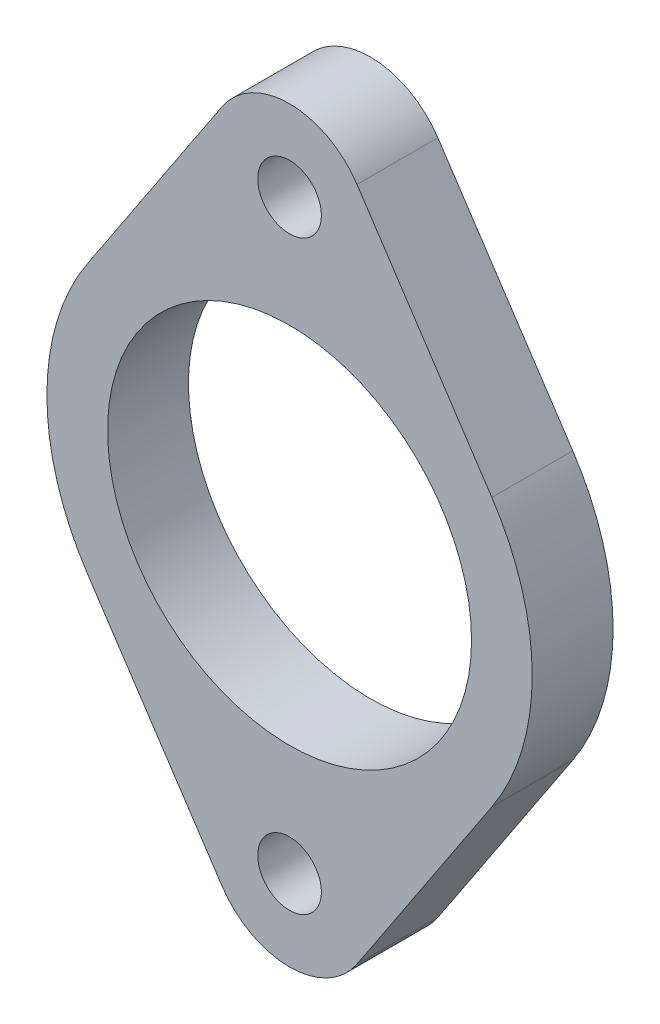
ISO-10303-21;
HEADER;
FILE_DESCRIPTION(('STEP AP214'),'2;1');
FILE_NAME('part.step','',(''),(''),'','','');
FILE_SCHEMA(('AUTOMOTIVE_DESIGN { 1 0 10303 214 1 1 1 1 }'));
ENDSEC;
DATA;
#1=APPLICATION_CONTEXT('core data for automotive mechanical design processes');
#2=APPLICATION_PROTOCOL_DEFINITION('international standard','automotive_design',2000,#1);
#3=PRODUCT_CONTEXT('',#1,'mechanical');
#4=PRODUCT('Part','Part','',(#3));
#5=PRODUCT_RELATED_PRODUCT_CATEGORY('part','',(#4));
#6=PRODUCT_DEFINITION_FORMATION('','',#4);
#7=PRODUCT_DEFINITION_CONTEXT('part definition',#1,'design');
#8=PRODUCT_DEFINITION('design','',#6,#7);
#9=PRODUCT_DEFINITION_SHAPE('','',#8);
#10=(LENGTH_UNIT() NAMED_UNIT(*) SI_UNIT(.MILLI.,.METRE.));
#11=(NAMED_UNIT(*) PLANE_ANGLE_UNIT() SI_UNIT($,.RADIAN.));
#12=(NAMED_UNIT(*) SI_UNIT($,.STERADIAN.) SOLID_ANGLE_UNIT());
#13=UNCERTAINTY_MEASURE_WITH_UNIT(LENGTH_MEASURE(1.E-05),#10,'distance_accuracy_value','');
#14=(GEOMETRIC_REPRESENTATION_CONTEXT(3) GLOBAL_UNCERTAINTY_ASSIGNED_CONTEXT((#13)) GLOBAL_UNIT_ASSIGNED_CONTEXT((#10,
#11,#12)) REPRESENTATION_CONTEXT('',''));
#15=CARTESIAN_POINT('',(0.,0.,0.));
#16=DIRECTION('',(0.,0.,1.));
#17=DIRECTION('',(1.,0.,0.));
#18=AXIS2_PLACEMENT_3D('',#15,#16,#17);
#19=CARTESIAN_POINT('',(0.,23.,3.175));
#20=DIRECTION('',(0.,0.,1.));
#21=DIRECTION('',(1.,0.,0.));
#22=AXIS2_PLACEMENT_3D('',#19,#20,#21);
#23=PLANE('',#22);
#24=CARTESIAN_POINT('',(0.,23.,3.175));
#25=DIRECTION('',(0.,0.,1.));
#26=DIRECTION('',(1.,0.,0.));
#27=AXIS2_PLACEMENT_3D('',#24,#25,#26);
#28=CIRCLE('',#27,2.5);
#29=CARTESIAN_POINT('',(2.5,23.,3.175));
#30=VERTEX_POINT('',#29);
#31=EDGE_CURVE('E232',#30,#30,#28,.T.);
#32=ORIENTED_EDGE('',*,*,#31,.F.);
#33=EDGE_LOOP('',(#32));
#34=FACE_BOUND('',#33,.T.);
#35=CARTESIAN_POINT('',(0.,-23.,3.175));
#36=DIRECTION('',(0.,0.,1.));
#37=DIRECTION('',(1.,0.,0.));
#38=AXIS2_PLACEMENT_3D('',#35,#36,#37);
#39=CIRCLE('',#38,2.5);
#40=CARTESIAN_POINT('',(2.5,-23.,3.175));
#41=VERTEX_POINT('',#40);
#42=EDGE_CURVE('E224',#41,#41,#39,.T.);
#43=ORIENTED_EDGE('',*,*,#42,.F.);
#44=EDGE_LOOP('',(#43));
#45=FACE_BOUND('',#44,.T.);
#46=CARTESIAN_POINT('',(0.,23.,3.175));
#47=DIRECTION('',(0.,0.,1.));
#48=DIRECTION('',(1.,0.,0.));
#49=AXIS2_PLACEMENT_3D('',#46,#47,#48);
#50=CIRCLE('',#49,6.35);
#51=CARTESIAN_POINT('',(5.29417886177034,26.5063043478261,3.175));
#52=VERTEX_POINT('',#51);
#53=CARTESIAN_POINT('',(-5.29417886177034,26.5063043478261,3.175));
#54=VERTEX_POINT('',#53);
#55=EDGE_CURVE('E168',#52,#54,#50,.T.);
#56=ORIENTED_EDGE('',*,*,#55,.T.);
#57=DIRECTION('',(-0.552173913043479,-0.833728954609502,0.));
#58=VECTOR('',#57,1.);
#59=CARTESIAN_POINT('',(-5.29417886177034,26.5063043478261,3.175));
#60=LINE('',#59,#58);
#61=CARTESIAN_POINT('',(-15.882536585311,10.5189130434783,3.175));
#62=VERTEX_POINT('',#61);
#63=EDGE_CURVE('E104',#54,#62,#60,.T.);
#64=ORIENTED_EDGE('',*,*,#63,.T.);
#65=CARTESIAN_POINT('',(0.,0.,3.175));
#66=DIRECTION('',(0.,0.,1.));
#67=DIRECTION('',(1.,0.,0.));
#68=AXIS2_PLACEMENT_3D('',#65,#66,#67);
#69=CIRCLE('',#68,19.05);
#70=CARTESIAN_POINT('',(-15.882536585311,-10.5189130434783,3.175));
#71=VERTEX_POINT('',#70);
#72=EDGE_CURVE('E189',#62,#71,#69,.T.);
#73=ORIENTED_EDGE('',*,*,#72,.T.);
#74=DIRECTION('',(0.552173913043478,-0.833728954609502,0.));
#75=VECTOR('',#74,1.);
#76=CARTESIAN_POINT('',(-5.29417886177033,-26.5063043478261,3.175));
#77=LINE('',#76,#75);
#78=CARTESIAN_POINT('',(-5.29417886177033,-26.5063043478261,3.175));
#79=VERTEX_POINT('',#78);
#80=EDGE_CURVE('E203',#71,#79,#77,.T.);
#81=ORIENTED_EDGE('',*,*,#80,.T.);
#82=CARTESIAN_POINT('',(0.,-23.,3.175));
#83=DIRECTION('',(0.,0.,1.));
#84=DIRECTION('',(-1.,0.,0.));
#85=AXIS2_PLACEMENT_3D('',#82,#83,#84);
#86=CIRCLE('',#85,6.34999999999999);
#87=CARTESIAN_POINT('',(5.29417886177033,-26.5063043478261,3.175));
#88=VERTEX_POINT('',#87);
#89=EDGE_CURVE('E123',#79,#88,#86,.T.);
#90=ORIENTED_EDGE('',*,*,#89,.T.);
#91=DIRECTION('',(0.552173913043478,0.833728954609502,0.));
#92=VECTOR('',#91,1.);
#93=CARTESIAN_POINT('',(5.29417886177033,-26.5063043478261,3.175));
#94=LINE('',#93,#92);
#95=CARTESIAN_POINT('',(15.882536585311,-10.5189130434783,3.175));
#96=VERTEX_POINT('',#95);
#97=EDGE_CURVE('E117',#88,#96,#94,.T.);
#98=ORIENTED_EDGE('',*,*,#97,.T.);
#99=CARTESIAN_POINT('',(0.,0.,3.175));
#100=DIRECTION('',(0.,0.,1.));
#101=DIRECTION('',(1.,0.,0.));
#102=AXIS2_PLACEMENT_3D('',#99,#100,#101);
#103=CIRCLE('',#102,19.05);
#104=CARTESIAN_POINT('',(15.882536585311,10.5189130434783,3.175));
#105=VERTEX_POINT('',#104);
#106=EDGE_CURVE('E121',#96,#105,#103,.T.);
#107=ORIENTED_EDGE('',*,*,#106,.T.);
#108=DIRECTION('',(-0.552173913043479,0.833728954609502,0.));
#109=VECTOR('',#108,1.);
#110=CARTESIAN_POINT('',(5.29417886177034,26.5063043478261,3.175));
#111=LINE('',#110,#109);
#112=EDGE_CURVE('E61',#105,#52,#111,.T.);
#113=ORIENTED_EDGE('',*,*,#112,.T.);
#114=EDGE_LOOP('',(#56,#64,#73,#81,#90,#98,#107,#113));
#115=FACE_BOUND('',#114,.T.);
#116=CARTESIAN_POINT('',(0.,0.,3.175));
#117=DIRECTION('',(0.,0.,1.));
#118=DIRECTION('',(1.,0.,0.));
#119=AXIS2_PLACEMENT_3D('',#116,#117,#118);
#120=CIRCLE('',#119,14.2875);
#121=CARTESIAN_POINT('',(14.2875,0.,3.175));
#122=VERTEX_POINT('',#121);
#123=EDGE_CURVE('E150',#122,#122,#120,.T.);
#124=ORIENTED_EDGE('',*,*,#123,.F.);
#125=EDGE_LOOP('',(#124));
#126=FACE_BOUND('',#125,.T.);
#127=ADVANCED_FACE('F43',(#34,#45,#115,#126),#23,.T.);
#128=CARTESIAN_POINT('',(0.,23.,-3.175));
#129=DIRECTION('',(0.,0.,1.));
#130=DIRECTION('',(1.,0.,0.));
#131=AXIS2_PLACEMENT_3D('',#128,#129,#130);
#132=PLANE('',#131);
#133=CARTESIAN_POINT('',(0.,23.,-3.175));
#134=DIRECTION('',(0.,0.,1.));
#135=DIRECTION('',(1.,0.,0.));
#136=AXIS2_PLACEMENT_3D('',#133,#134,#135);
#137=CIRCLE('',#136,2.5);
#138=CARTESIAN_POINT('',(2.5,23.,-3.175));
#139=VERTEX_POINT('',#138);
#140=EDGE_CURVE('E228',#139,#139,#137,.T.);
#141=ORIENTED_EDGE('',*,*,#140,.T.);
#142=EDGE_LOOP('',(#141));
#143=FACE_BOUND('',#142,.T.);
#144=CARTESIAN_POINT('',(0.,-23.,-3.175));
#145=DIRECTION('',(0.,0.,1.));
#146=DIRECTION('',(1.,0.,0.));
#147=AXIS2_PLACEMENT_3D('',#144,#145,#146);
#148=CIRCLE('',#147,2.5);
#149=CARTESIAN_POINT('',(2.5,-23.,-3.175));
#150=VERTEX_POINT('',#149);
#151=EDGE_CURVE('E217',#150,#150,#148,.T.);
#152=ORIENTED_EDGE('',*,*,#151,.T.);
#153=EDGE_LOOP('',(#152));
#154=FACE_BOUND('',#153,.T.);
#155=CARTESIAN_POINT('',(0.,23.,-3.175));
#156=DIRECTION('',(0.,0.,1.));
#157=DIRECTION('',(1.,0.,0.));
#158=AXIS2_PLACEMENT_3D('',#155,#156,#157);
#159=CIRCLE('',#158,6.35);
#160=CARTESIAN_POINT('',(5.29417886177034,26.5063043478261,-3.175));
#161=VERTEX_POINT('',#160);
#162=CARTESIAN_POINT('',(-5.29417886177034,26.5063043478261,-3.175));
#163=VERTEX_POINT('',#162);
#164=EDGE_CURVE('E145',#161,#163,#159,.T.);
#165=ORIENTED_EDGE('',*,*,#164,.F.);
#166=DIRECTION('',(-0.552173913043479,0.833728954609502,0.));
#167=VECTOR('',#166,1.);
#168=CARTESIAN_POINT('',(5.29417886177034,26.5063043478261,-3.175));
#169=LINE('',#168,#167);
#170=CARTESIAN_POINT('',(15.882536585311,10.5189130434783,-3.175));
#171=VERTEX_POINT('',#170);
#172=EDGE_CURVE('E96',#171,#161,#169,.T.);
#173=ORIENTED_EDGE('',*,*,#172,.F.);
#174=CARTESIAN_POINT('',(0.,0.,-3.175));
#175=DIRECTION('',(0.,0.,1.));
#176=DIRECTION('',(1.,0.,0.));
#177=AXIS2_PLACEMENT_3D('',#174,#175,#176);
#178=CIRCLE('',#177,19.05);
#179=CARTESIAN_POINT('',(15.882536585311,-10.5189130434783,-3.175));
#180=VERTEX_POINT('',#179);
#181=EDGE_CURVE('E90',#180,#171,#178,.T.);
#182=ORIENTED_EDGE('',*,*,#181,.F.);
#183=DIRECTION('',(0.552173913043478,0.833728954609502,0.));
#184=VECTOR('',#183,1.);
#185=CARTESIAN_POINT('',(5.29417886177033,-26.5063043478261,-3.175));
#186=LINE('',#185,#184);
#187=CARTESIAN_POINT('',(5.29417886177033,-26.5063043478261,-3.175));
#188=VERTEX_POINT('',#187);
#189=EDGE_CURVE('E132',#188,#180,#186,.T.);
#190=ORIENTED_EDGE('',*,*,#189,.F.);
#191=CARTESIAN_POINT('',(0.,-23.,-3.175));
#192=DIRECTION('',(0.,0.,1.));
#193=DIRECTION('',(-1.,0.,0.));
#194=AXIS2_PLACEMENT_3D('',#191,#192,#193);
#195=CIRCLE('',#194,6.34999999999999);
#196=CARTESIAN_POINT('',(-5.29417886177033,-26.5063043478261,-3.175));
#197=VERTEX_POINT('',#196);
#198=EDGE_CURVE('E159',#197,#188,#195,.T.);
#199=ORIENTED_EDGE('',*,*,#198,.F.);
#200=DIRECTION('',(0.552173913043478,-0.833728954609502,0.));
#201=VECTOR('',#200,1.);
#202=CARTESIAN_POINT('',(-5.29417886177033,-26.5063043478261,-3.175));
#203=LINE('',#202,#201);
#204=CARTESIAN_POINT('',(-15.882536585311,-10.5189130434783,-3.175));
#205=VERTEX_POINT('',#204);
#206=EDGE_CURVE('E156',#205,#197,#203,.T.);
#207=ORIENTED_EDGE('',*,*,#206,.F.);
#208=CARTESIAN_POINT('',(0.,0.,-3.175));
#209=DIRECTION('',(0.,0.,1.));
#210=DIRECTION('',(1.,0.,0.));
#211=AXIS2_PLACEMENT_3D('',#208,#209,#210);
#212=CIRCLE('',#211,19.05);
#213=CARTESIAN_POINT('',(-15.882536585311,10.5189130434783,-3.175));
#214=VERTEX_POINT('',#213);
#215=EDGE_CURVE('E153',#214,#205,#212,.T.);
#216=ORIENTED_EDGE('',*,*,#215,.F.);
#217=DIRECTION('',(-0.552173913043479,-0.833728954609502,0.));
#218=VECTOR('',#217,1.);
#219=CARTESIAN_POINT('',(-5.29417886177034,26.5063043478261,-3.175));
#220=LINE('',#219,#218);
#221=EDGE_CURVE('E149',#163,#214,#220,.T.);
#222=ORIENTED_EDGE('',*,*,#221,.F.);
#223=EDGE_LOOP('',(#165,#173,#182,#190,#199,#207,#216,#222));
#224=FACE_BOUND('',#223,.T.);
#225=CARTESIAN_POINT('',(0.,0.,-3.175));
#226=DIRECTION('',(0.,0.,1.));
#227=DIRECTION('',(1.,0.,0.));
#228=AXIS2_PLACEMENT_3D('',#225,#226,#227);
#229=CIRCLE('',#228,14.2875);
#230=CARTESIAN_POINT('',(14.2875,0.,-3.175));
#231=VERTEX_POINT('',#230);
#232=EDGE_CURVE('E213',#231,#231,#229,.T.);
#233=ORIENTED_EDGE('',*,*,#232,.T.);
#234=EDGE_LOOP('',(#233));
#235=FACE_BOUND('',#234,.T.);
#236=ADVANCED_FACE('F193',(#143,#154,#224,#235),#132,.F.);
#237=CARTESIAN_POINT('',(0.,23.,3.175));
#238=DIRECTION('',(0.,0.,-1.));
#239=DIRECTION('',(-1.,0.,0.));
#240=AXIS2_PLACEMENT_3D('',#237,#238,#239);
#241=CYLINDRICAL_SURFACE('',#240,6.35);
#242=ORIENTED_EDGE('',*,*,#164,.T.);
#243=DIRECTION('',(0.,0.,-1.));
#244=VECTOR('',#243,1.);
#245=CARTESIAN_POINT('',(-5.29417886177034,26.5063043478261,3.175));
#246=LINE('',#245,#244);
#247=EDGE_CURVE('E11',#54,#163,#246,.T.);
#248=ORIENTED_EDGE('',*,*,#247,.F.);
#249=ORIENTED_EDGE('',*,*,#55,.F.);
#250=DIRECTION('',(0.,0.,-1.));
#251=VECTOR('',#250,1.);
#252=CARTESIAN_POINT('',(5.29417886177034,26.5063043478261,3.175));
#253=LINE('',#252,#251);
#254=EDGE_CURVE('E141',#52,#161,#253,.T.);
#255=ORIENTED_EDGE('',*,*,#254,.T.);
#256=EDGE_LOOP('',(#242,#248,#249,#255));
#257=FACE_BOUND('',#256,.T.);
#258=ADVANCED_FACE('F45',(#257),#241,.T.);
#259=CARTESIAN_POINT('',(-5.29417886177034,26.5063043478261,3.175));
#260=DIRECTION('',(0.833728954609502,-0.552173913043479,0.));
#261=DIRECTION('',(0.552173913043479,0.833728954609502,0.));
#262=AXIS2_PLACEMENT_3D('',#259,#260,#261);
#263=PLANE('',#262);
#264=ORIENTED_EDGE('',*,*,#221,.T.);
#265=DIRECTION('',(0.,0.,-1.));
#266=VECTOR('',#265,1.);
#267=CARTESIAN_POINT('',(-15.882536585311,10.5189130434783,3.175));
#268=LINE('',#267,#266);
#269=EDGE_CURVE('E53',#62,#214,#268,.T.);
#270=ORIENTED_EDGE('',*,*,#269,.F.);
#271=ORIENTED_EDGE('',*,*,#63,.F.);
#272=ORIENTED_EDGE('',*,*,#247,.T.);
#273=EDGE_LOOP('',(#264,#270,#271,#272));
#274=FACE_BOUND('',#273,.T.);
#275=ADVANCED_FACE('F274',(#274),#263,.F.);
#276=CARTESIAN_POINT('',(0.,0.,3.175));
#277=DIRECTION('',(0.,0.,-1.));
#278=DIRECTION('',(-1.,0.,0.));
#279=AXIS2_PLACEMENT_3D('',#276,#277,#278);
#280=CYLINDRICAL_SURFACE('',#279,19.05);
#281=ORIENTED_EDGE('',*,*,#215,.T.);
#282=DIRECTION('',(0.,0.,-1.));
#283=VECTOR('',#282,1.);
#284=CARTESIAN_POINT('',(-15.882536585311,-10.5189130434783,3.175));
#285=LINE('',#284,#283);
#286=EDGE_CURVE('E179',#71,#205,#285,.T.);
#287=ORIENTED_EDGE('',*,*,#286,.F.);
#288=ORIENTED_EDGE('',*,*,#72,.F.);
#289=ORIENTED_EDGE('',*,*,#269,.T.);
#290=EDGE_LOOP('',(#281,#287,#288,#289));
#291=FACE_BOUND('',#290,.T.);
#292=ADVANCED_FACE('F187',(#291),#280,.T.);
#293=CARTESIAN_POINT('',(-5.29417886177033,-26.5063043478261,3.175));
#294=DIRECTION('',(0.833728954609502,0.552173913043478,0.));
#295=DIRECTION('',(-0.552173913043478,0.833728954609502,0.));
#296=AXIS2_PLACEMENT_3D('',#293,#294,#295);
#297=PLANE('',#296);
#298=ORIENTED_EDGE('',*,*,#206,.T.);
#299=DIRECTION('',(0.,0.,-1.));
#300=VECTOR('',#299,1.);
#301=CARTESIAN_POINT('',(-5.29417886177033,-26.5063043478261,3.175));
#302=LINE('',#301,#300);
#303=EDGE_CURVE('E175',#79,#197,#302,.T.);
#304=ORIENTED_EDGE('',*,*,#303,.F.);
#305=ORIENTED_EDGE('',*,*,#80,.F.);
#306=ORIENTED_EDGE('',*,*,#286,.T.);
#307=EDGE_LOOP('',(#298,#304,#305,#306));
#308=FACE_BOUND('',#307,.T.);
#309=ADVANCED_FACE('F198',(#308),#297,.F.);
#310=CARTESIAN_POINT('',(0.,-23.,3.175));
#311=DIRECTION('',(0.,0.,-1.));
#312=DIRECTION('',(-1.,0.,0.));
#313=AXIS2_PLACEMENT_3D('',#310,#311,#312);
#314=CYLINDRICAL_SURFACE('',#313,6.34999999999999);
#315=ORIENTED_EDGE('',*,*,#198,.T.);
#316=DIRECTION('',(0.,0.,-1.));
#317=VECTOR('',#316,1.);
#318=CARTESIAN_POINT('',(5.29417886177033,-26.5063043478261,3.175));
#319=LINE('',#318,#317);
#320=EDGE_CURVE('E134',#88,#188,#319,.T.);
#321=ORIENTED_EDGE('',*,*,#320,.F.);
#322=ORIENTED_EDGE('',*,*,#89,.F.);
#323=ORIENTED_EDGE('',*,*,#303,.T.);
#324=EDGE_LOOP('',(#315,#321,#322,#323));
#325=FACE_BOUND('',#324,.T.);
#326=ADVANCED_FACE('F201',(#325),#314,.T.);
#327=CARTESIAN_POINT('',(5.29417886177033,-26.5063043478261,3.175));
#328=DIRECTION('',(-0.833728954609502,0.552173913043478,0.));
#329=DIRECTION('',(-0.552173913043478,-0.833728954609502,0.));
#330=AXIS2_PLACEMENT_3D('',#327,#328,#329);
#331=PLANE('',#330);
#332=ORIENTED_EDGE('',*,*,#189,.T.);
#333=DIRECTION('',(0.,0.,-1.));
#334=VECTOR('',#333,1.);
#335=CARTESIAN_POINT('',(15.882536585311,-10.5189130434783,3.175));
#336=LINE('',#335,#334);
#337=EDGE_CURVE('E129',#96,#180,#336,.T.);
#338=ORIENTED_EDGE('',*,*,#337,.F.);
#339=ORIENTED_EDGE('',*,*,#97,.F.);
#340=ORIENTED_EDGE('',*,*,#320,.T.);
#341=EDGE_LOOP('',(#332,#338,#339,#340));
#342=FACE_BOUND('',#341,.T.);
#343=ADVANCED_FACE('F130',(#342),#331,.F.);
#344=CARTESIAN_POINT('',(0.,0.,3.175));
#345=DIRECTION('',(0.,0.,-1.));
#346=DIRECTION('',(-1.,0.,0.));
#347=AXIS2_PLACEMENT_3D('',#344,#345,#346);
#348=CYLINDRICAL_SURFACE('',#347,19.05);
#349=ORIENTED_EDGE('',*,*,#181,.T.);
#350=DIRECTION('',(0.,0.,-1.));
#351=VECTOR('',#350,1.);
#352=CARTESIAN_POINT('',(15.882536585311,10.5189130434783,3.175));
#353=LINE('',#352,#351);
#354=EDGE_CURVE('E135',#105,#171,#353,.T.);
#355=ORIENTED_EDGE('',*,*,#354,.F.);
#356=ORIENTED_EDGE('',*,*,#106,.F.);
#357=ORIENTED_EDGE('',*,*,#337,.T.);
#358=EDGE_LOOP('',(#349,#355,#356,#357));
#359=FACE_BOUND('',#358,.T.);
#360=ADVANCED_FACE('F137',(#359),#348,.T.);
#361=CARTESIAN_POINT('',(5.29417886177034,26.5063043478261,3.175));
#362=DIRECTION('',(-0.833728954609502,-0.552173913043479,0.));
#363=DIRECTION('',(0.552173913043479,-0.833728954609502,0.));
#364=AXIS2_PLACEMENT_3D('',#361,#362,#363);
#365=PLANE('',#364);
#366=ORIENTED_EDGE('',*,*,#172,.T.);
#367=ORIENTED_EDGE('',*,*,#254,.F.);
#368=ORIENTED_EDGE('',*,*,#112,.F.);
#369=ORIENTED_EDGE('',*,*,#354,.T.);
#370=EDGE_LOOP('',(#366,#367,#368,#369));
#371=FACE_BOUND('',#370,.T.);
#372=ADVANCED_FACE('F255',(#371),#365,.F.);
#373=CARTESIAN_POINT('',(0.,0.,3.175));
#374=DIRECTION('',(0.,0.,-1.));
#375=DIRECTION('',(-1.,0.,0.));
#376=AXIS2_PLACEMENT_3D('',#373,#374,#375);
#377=CYLINDRICAL_SURFACE('',#376,14.2875);
#378=ORIENTED_EDGE('',*,*,#123,.T.);
#379=EDGE_LOOP('',(#378));
#380=FACE_BOUND('',#379,.T.);
#381=ORIENTED_EDGE('',*,*,#232,.F.);
#382=EDGE_LOOP('',(#381));
#383=FACE_BOUND('',#382,.T.);
#384=ADVANCED_FACE('F246',(#380,#383),#377,.F.);
#385=CARTESIAN_POINT('',(0.,-23.,3.175));
#386=DIRECTION('',(0.,0.,1.));
#387=DIRECTION('',(1.,0.,0.));
#388=AXIS2_PLACEMENT_3D('',#385,#386,#387);
#389=CYLINDRICAL_SURFACE('',#388,2.5);
#390=ORIENTED_EDGE('',*,*,#151,.F.);
#391=EDGE_LOOP('',(#390));
#392=FACE_BOUND('',#391,.T.);
#393=ORIENTED_EDGE('',*,*,#42,.T.);
#394=EDGE_LOOP('',(#393));
#395=FACE_BOUND('',#394,.T.);
#396=ADVANCED_FACE('F244',(#392,#395),#389,.F.);
#397=CARTESIAN_POINT('',(0.,23.,3.175));
#398=DIRECTION('',(0.,0.,1.));
#399=DIRECTION('',(1.,0.,0.));
#400=AXIS2_PLACEMENT_3D('',#397,#398,#399);
#401=CYLINDRICAL_SURFACE('',#400,2.5);
#402=ORIENTED_EDGE('',*,*,#140,.F.);
#403=EDGE_LOOP('',(#402));
#404=FACE_BOUND('',#403,.T.);
#405=ORIENTED_EDGE('',*,*,#31,.T.);
#406=EDGE_LOOP('',(#405));
#407=FACE_BOUND('',#406,.T.);
#408=ADVANCED_FACE('F237',(#404,#407),#401,.F.);
#409=CLOSED_SHELL('',(#127,#236,#258,#275,#292,#309,#326,#343,#360,#372,#384,#396,#408));
#410=MANIFOLD_SOLID_BREP('B2',#409);
#411=ADVANCED_BREP_SHAPE_REPRESENTATION('',(#18,#410),#14);
#412=SHAPE_DEFINITION_REPRESENTATION(#9,#411);
ENDSEC;
END-ISO-10303-21;
